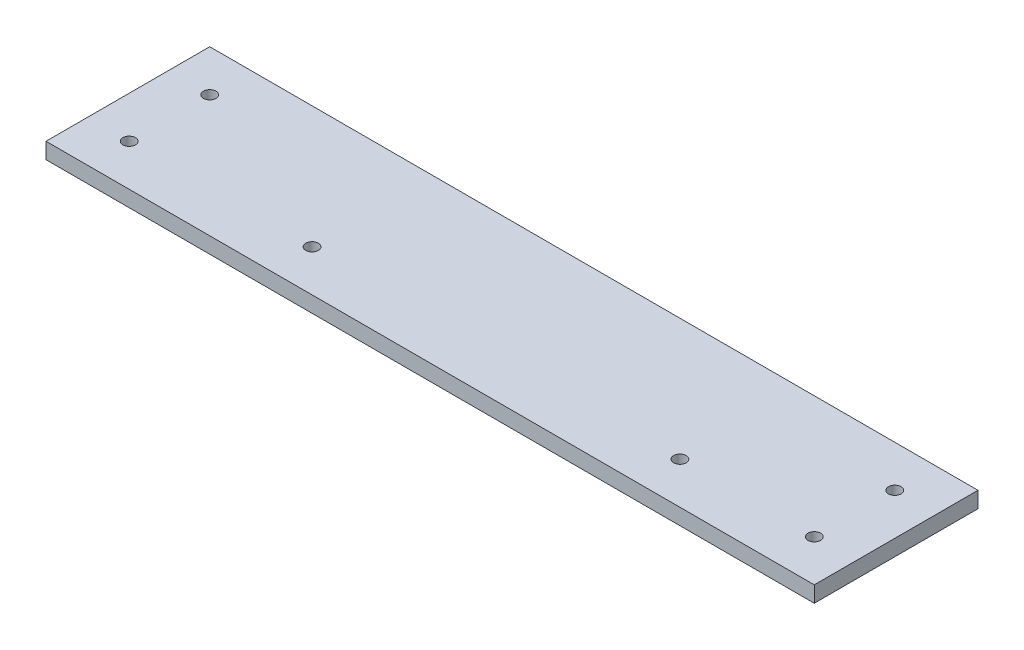
ISO-10303-21;
HEADER;
FILE_DESCRIPTION(('STEP AP214'),'2;1');
FILE_NAME('part.step','',(''),(''),'','','');
FILE_SCHEMA(('AUTOMOTIVE_DESIGN { 1 0 10303 214 1 1 1 1 }'));
ENDSEC;
DATA;
#1=APPLICATION_CONTEXT('core data for automotive mechanical design processes');
#2=APPLICATION_PROTOCOL_DEFINITION('international standard','automotive_design',2000,#1);
#3=PRODUCT_CONTEXT('',#1,'mechanical');
#4=PRODUCT('Part','Part','',(#3));
#5=PRODUCT_RELATED_PRODUCT_CATEGORY('part','',(#4));
#6=PRODUCT_DEFINITION_FORMATION('','',#4);
#7=PRODUCT_DEFINITION_CONTEXT('part definition',#1,'design');
#8=PRODUCT_DEFINITION('design','',#6,#7);
#9=PRODUCT_DEFINITION_SHAPE('','',#8);
#10=(LENGTH_UNIT() NAMED_UNIT(*) SI_UNIT(.MILLI.,.METRE.));
#11=(NAMED_UNIT(*) PLANE_ANGLE_UNIT() SI_UNIT($,.RADIAN.));
#12=(NAMED_UNIT(*) SI_UNIT($,.STERADIAN.) SOLID_ANGLE_UNIT());
#13=UNCERTAINTY_MEASURE_WITH_UNIT(LENGTH_MEASURE(1.E-05),#10,'distance_accuracy_value','');
#14=(GEOMETRIC_REPRESENTATION_CONTEXT(3) GLOBAL_UNCERTAINTY_ASSIGNED_CONTEXT((#13)) GLOBAL_UNIT_ASSIGNED_CONTEXT((#10,
#11,#12)) REPRESENTATION_CONTEXT('',''));
#15=CARTESIAN_POINT('',(0.,0.,0.));
#16=DIRECTION('',(0.,0.,1.));
#17=DIRECTION('',(1.,0.,0.));
#18=AXIS2_PLACEMENT_3D('',#15,#16,#17);
#19=CARTESIAN_POINT('',(152.5,3.175,32.5));
#20=DIRECTION('',(-1.,0.,0.));
#21=DIRECTION('',(0.,0.,1.));
#22=AXIS2_PLACEMENT_3D('',#19,#20,#21);
#23=PLANE('',#22);
#24=DIRECTION('',(0.,0.,-1.));
#25=VECTOR('',#24,1.);
#26=CARTESIAN_POINT('',(152.5,-3.175,32.5));
#27=LINE('',#26,#25);
#28=CARTESIAN_POINT('',(152.5,-3.175,32.5));
#29=VERTEX_POINT('',#28);
#30=CARTESIAN_POINT('',(152.5,-3.175,-32.5));
#31=VERTEX_POINT('',#30);
#32=EDGE_CURVE('E99',#29,#31,#27,.T.);
#33=ORIENTED_EDGE('',*,*,#32,.T.);
#34=DIRECTION('',(0.,-1.,0.));
#35=VECTOR('',#34,1.);
#36=CARTESIAN_POINT('',(152.5,3.175,-32.5));
#37=LINE('',#36,#35);
#38=CARTESIAN_POINT('',(152.5,3.175,-32.5));
#39=VERTEX_POINT('',#38);
#40=EDGE_CURVE('E11',#39,#31,#37,.T.);
#41=ORIENTED_EDGE('',*,*,#40,.F.);
#42=DIRECTION('',(0.,0.,-1.));
#43=VECTOR('',#42,1.);
#44=CARTESIAN_POINT('',(152.5,3.175,32.5));
#45=LINE('',#44,#43);
#46=CARTESIAN_POINT('',(152.5,3.175,32.5));
#47=VERTEX_POINT('',#46);
#48=EDGE_CURVE('E87',#47,#39,#45,.T.);
#49=ORIENTED_EDGE('',*,*,#48,.F.);
#50=DIRECTION('',(0.,-1.,0.));
#51=VECTOR('',#50,1.);
#52=CARTESIAN_POINT('',(152.5,3.175,32.5));
#53=LINE('',#52,#51);
#54=EDGE_CURVE('E95',#47,#29,#53,.T.);
#55=ORIENTED_EDGE('',*,*,#54,.T.);
#56=EDGE_LOOP('',(#33,#41,#49,#55));
#57=FACE_BOUND('',#56,.T.);
#58=ADVANCED_FACE('F36',(#57),#23,.F.);
#59=CARTESIAN_POINT('',(-152.5,3.175,-32.5));
#60=DIRECTION('',(0.,0.,1.));
#61=DIRECTION('',(1.,0.,0.));
#62=AXIS2_PLACEMENT_3D('',#59,#60,#61);
#63=PLANE('',#62);
#64=DIRECTION('',(-1.,0.,0.));
#65=VECTOR('',#64,1.);
#66=CARTESIAN_POINT('',(-152.5,-3.175,-32.5));
#67=LINE('',#66,#65);
#68=CARTESIAN_POINT('',(-152.5,-3.175,-32.5));
#69=VERTEX_POINT('',#68);
#70=EDGE_CURVE('E91',#31,#69,#67,.T.);
#71=ORIENTED_EDGE('',*,*,#70,.T.);
#72=DIRECTION('',(0.,-1.,0.));
#73=VECTOR('',#72,1.);
#74=CARTESIAN_POINT('',(-152.5,3.175,-32.5));
#75=LINE('',#74,#73);
#76=CARTESIAN_POINT('',(-152.5,3.175,-32.5));
#77=VERTEX_POINT('',#76);
#78=EDGE_CURVE('E44',#77,#69,#75,.T.);
#79=ORIENTED_EDGE('',*,*,#78,.F.);
#80=DIRECTION('',(-1.,0.,0.));
#81=VECTOR('',#80,1.);
#82=CARTESIAN_POINT('',(-152.5,3.175,-32.5));
#83=LINE('',#82,#81);
#84=EDGE_CURVE('E82',#39,#77,#83,.T.);
#85=ORIENTED_EDGE('',*,*,#84,.F.);
#86=ORIENTED_EDGE('',*,*,#40,.T.);
#87=EDGE_LOOP('',(#71,#79,#85,#86));
#88=FACE_BOUND('',#87,.T.);
#89=ADVANCED_FACE('F90',(#88),#63,.F.);
#90=CARTESIAN_POINT('',(-152.5,3.175,32.5));
#91=DIRECTION('',(1.,0.,0.));
#92=DIRECTION('',(0.,0.,-1.));
#93=AXIS2_PLACEMENT_3D('',#90,#91,#92);
#94=PLANE('',#93);
#95=DIRECTION('',(0.,0.,1.));
#96=VECTOR('',#95,1.);
#97=CARTESIAN_POINT('',(-152.5,-3.175,32.5));
#98=LINE('',#97,#96);
#99=CARTESIAN_POINT('',(-152.5,-3.175,32.5));
#100=VERTEX_POINT('',#99);
#101=EDGE_CURVE('E69',#69,#100,#98,.T.);
#102=ORIENTED_EDGE('',*,*,#101,.T.);
#103=DIRECTION('',(0.,-1.,0.));
#104=VECTOR('',#103,1.);
#105=CARTESIAN_POINT('',(-152.5,3.175,32.5));
#106=LINE('',#105,#104);
#107=CARTESIAN_POINT('',(-152.5,3.175,32.5));
#108=VERTEX_POINT('',#107);
#109=EDGE_CURVE('E92',#108,#100,#106,.T.);
#110=ORIENTED_EDGE('',*,*,#109,.F.);
#111=DIRECTION('',(0.,0.,1.));
#112=VECTOR('',#111,1.);
#113=CARTESIAN_POINT('',(-152.5,3.175,32.5));
#114=LINE('',#113,#112);
#115=EDGE_CURVE('E85',#77,#108,#114,.T.);
#116=ORIENTED_EDGE('',*,*,#115,.F.);
#117=ORIENTED_EDGE('',*,*,#78,.T.);
#118=EDGE_LOOP('',(#102,#110,#116,#117));
#119=FACE_BOUND('',#118,.T.);
#120=ADVANCED_FACE('F93',(#119),#94,.F.);
#121=CARTESIAN_POINT('',(-152.5,3.175,32.5));
#122=DIRECTION('',(0.,0.,-1.));
#123=DIRECTION('',(-1.,0.,0.));
#124=AXIS2_PLACEMENT_3D('',#121,#122,#123);
#125=PLANE('',#124);
#126=DIRECTION('',(1.,0.,0.));
#127=VECTOR('',#126,1.);
#128=CARTESIAN_POINT('',(-152.5,-3.175,32.5));
#129=LINE('',#128,#127);
#130=EDGE_CURVE('E75',#100,#29,#129,.T.);
#131=ORIENTED_EDGE('',*,*,#130,.T.);
#132=ORIENTED_EDGE('',*,*,#54,.F.);
#133=DIRECTION('',(1.,0.,0.));
#134=VECTOR('',#133,1.);
#135=CARTESIAN_POINT('',(-152.5,3.175,32.5));
#136=LINE('',#135,#134);
#137=EDGE_CURVE('E52',#108,#47,#136,.T.);
#138=ORIENTED_EDGE('',*,*,#137,.F.);
#139=ORIENTED_EDGE('',*,*,#109,.T.);
#140=EDGE_LOOP('',(#131,#132,#138,#139));
#141=FACE_BOUND('',#140,.T.);
#142=ADVANCED_FACE('F107',(#141),#125,.F.);
#143=CARTESIAN_POINT('',(0.,3.175,0.));
#144=DIRECTION('',(0.,-1.,0.));
#145=DIRECTION('',(0.,0.,-1.));
#146=AXIS2_PLACEMENT_3D('',#143,#144,#145);
#147=PLANE('',#146);
#148=CARTESIAN_POINT('',(82.64,3.175,15.98));
#149=DIRECTION('',(0.,-1.,0.));
#150=DIRECTION('',(0.,0.,-1.));
#151=AXIS2_PLACEMENT_3D('',#148,#149,#150);
#152=CIRCLE('',#151,2.49999999999995);
#153=CARTESIAN_POINT('',(82.64,3.175,13.4800000000001));
#154=VERTEX_POINT('',#153);
#155=EDGE_CURVE('E132',#154,#154,#152,.T.);
#156=ORIENTED_EDGE('',*,*,#155,.T.);
#157=EDGE_LOOP('',(#156));
#158=FACE_BOUND('',#157,.T.);
#159=CARTESIAN_POINT('',(-63.41,3.175,15.98));
#160=DIRECTION('',(0.,-1.,0.));
#161=DIRECTION('',(0.,0.,-1.));
#162=AXIS2_PLACEMENT_3D('',#159,#160,#161);
#163=CIRCLE('',#162,2.49999999999995);
#164=CARTESIAN_POINT('',(-63.41,3.175,13.4800000000001));
#165=VERTEX_POINT('',#164);
#166=EDGE_CURVE('E139',#165,#165,#163,.T.);
#167=ORIENTED_EDGE('',*,*,#166,.T.);
#168=EDGE_LOOP('',(#167));
#169=FACE_BOUND('',#168,.T.);
#170=CARTESIAN_POINT('',(135.98,3.175,15.98));
#171=DIRECTION('',(0.,1.,0.));
#172=DIRECTION('',(0.,0.,-1.));
#173=AXIS2_PLACEMENT_3D('',#170,#171,#172);
#174=CIRCLE('',#173,2.49999999999994);
#175=CARTESIAN_POINT('',(135.98,3.175,13.4800000000001));
#176=VERTEX_POINT('',#175);
#177=EDGE_CURVE('E120',#176,#176,#174,.T.);
#178=ORIENTED_EDGE('',*,*,#177,.F.);
#179=EDGE_LOOP('',(#178));
#180=FACE_BOUND('',#179,.T.);
#181=CARTESIAN_POINT('',(135.98,3.175,-15.98));
#182=DIRECTION('',(0.,1.,0.));
#183=DIRECTION('',(0.,0.,1.));
#184=AXIS2_PLACEMENT_3D('',#181,#182,#183);
#185=CIRCLE('',#184,2.49999999999994);
#186=CARTESIAN_POINT('',(135.98,3.175,-13.4800000000001));
#187=VERTEX_POINT('',#186);
#188=EDGE_CURVE('E125',#187,#187,#185,.T.);
#189=ORIENTED_EDGE('',*,*,#188,.F.);
#190=EDGE_LOOP('',(#189));
#191=FACE_BOUND('',#190,.T.);
#192=CARTESIAN_POINT('',(-135.98,3.175,15.98));
#193=DIRECTION('',(0.,-1.,0.));
#194=DIRECTION('',(0.,0.,-1.));
#195=AXIS2_PLACEMENT_3D('',#192,#193,#194);
#196=CIRCLE('',#195,2.49999999999994);
#197=CARTESIAN_POINT('',(-135.98,3.175,13.4800000000001));
#198=VERTEX_POINT('',#197);
#199=EDGE_CURVE('E102',#198,#198,#196,.T.);
#200=ORIENTED_EDGE('',*,*,#199,.T.);
#201=EDGE_LOOP('',(#200));
#202=FACE_BOUND('',#201,.T.);
#203=CARTESIAN_POINT('',(-135.98,3.175,-15.98));
#204=DIRECTION('',(0.,-1.,0.));
#205=DIRECTION('',(0.,0.,1.));
#206=AXIS2_PLACEMENT_3D('',#203,#204,#205);
#207=CIRCLE('',#206,2.49999999999994);
#208=CARTESIAN_POINT('',(-135.98,3.175,-13.4800000000001));
#209=VERTEX_POINT('',#208);
#210=EDGE_CURVE('E113',#209,#209,#207,.T.);
#211=ORIENTED_EDGE('',*,*,#210,.T.);
#212=EDGE_LOOP('',(#211));
#213=FACE_BOUND('',#212,.T.);
#214=ORIENTED_EDGE('',*,*,#48,.T.);
#215=ORIENTED_EDGE('',*,*,#84,.T.);
#216=ORIENTED_EDGE('',*,*,#115,.T.);
#217=ORIENTED_EDGE('',*,*,#137,.T.);
#218=EDGE_LOOP('',(#214,#215,#216,#217));
#219=FACE_BOUND('',#218,.T.);
#220=ADVANCED_FACE('F83',(#158,#169,#180,#191,#202,#213,#219),#147,.F.);
#221=CARTESIAN_POINT('',(0.,-3.175,0.));
#222=DIRECTION('',(0.,-1.,0.));
#223=DIRECTION('',(0.,0.,-1.));
#224=AXIS2_PLACEMENT_3D('',#221,#222,#223);
#225=PLANE('',#224);
#226=CARTESIAN_POINT('',(82.64,-3.175,15.98));
#227=DIRECTION('',(0.,1.,0.));
#228=DIRECTION('',(0.,0.,1.));
#229=AXIS2_PLACEMENT_3D('',#226,#227,#228);
#230=CIRCLE('',#229,2.49999999999995);
#231=CARTESIAN_POINT('',(82.64,-3.175,18.48));
#232=VERTEX_POINT('',#231);
#233=EDGE_CURVE('E142',#232,#232,#230,.T.);
#234=ORIENTED_EDGE('',*,*,#233,.T.);
#235=EDGE_LOOP('',(#234));
#236=FACE_BOUND('',#235,.T.);
#237=CARTESIAN_POINT('',(-63.41,-3.175,15.98));
#238=DIRECTION('',(0.,1.,0.));
#239=DIRECTION('',(0.,0.,1.));
#240=AXIS2_PLACEMENT_3D('',#237,#238,#239);
#241=CIRCLE('',#240,2.49999999999995);
#242=CARTESIAN_POINT('',(-63.41,-3.175,18.48));
#243=VERTEX_POINT('',#242);
#244=EDGE_CURVE('E143',#243,#243,#241,.T.);
#245=ORIENTED_EDGE('',*,*,#244,.T.);
#246=EDGE_LOOP('',(#245));
#247=FACE_BOUND('',#246,.T.);
#248=CARTESIAN_POINT('',(135.98,-3.175,15.98));
#249=DIRECTION('',(0.,1.,0.));
#250=DIRECTION('',(0.,0.,-1.));
#251=AXIS2_PLACEMENT_3D('',#248,#249,#250);
#252=CIRCLE('',#251,2.49999999999994);
#253=CARTESIAN_POINT('',(135.98,-3.175,13.4800000000001));
#254=VERTEX_POINT('',#253);
#255=EDGE_CURVE('E128',#254,#254,#252,.T.);
#256=ORIENTED_EDGE('',*,*,#255,.T.);
#257=EDGE_LOOP('',(#256));
#258=FACE_BOUND('',#257,.T.);
#259=CARTESIAN_POINT('',(135.98,-3.175,-15.98));
#260=DIRECTION('',(0.,1.,0.));
#261=DIRECTION('',(0.,0.,1.));
#262=AXIS2_PLACEMENT_3D('',#259,#260,#261);
#263=CIRCLE('',#262,2.49999999999994);
#264=CARTESIAN_POINT('',(135.98,-3.175,-13.4800000000001));
#265=VERTEX_POINT('',#264);
#266=EDGE_CURVE('E129',#265,#265,#263,.T.);
#267=ORIENTED_EDGE('',*,*,#266,.T.);
#268=EDGE_LOOP('',(#267));
#269=FACE_BOUND('',#268,.T.);
#270=CARTESIAN_POINT('',(-135.98,-3.175,15.98));
#271=DIRECTION('',(0.,-1.,0.));
#272=DIRECTION('',(0.,0.,-1.));
#273=AXIS2_PLACEMENT_3D('',#270,#271,#272);
#274=CIRCLE('',#273,2.49999999999994);
#275=CARTESIAN_POINT('',(-135.98,-3.175,13.4800000000001));
#276=VERTEX_POINT('',#275);
#277=EDGE_CURVE('E116',#276,#276,#274,.T.);
#278=ORIENTED_EDGE('',*,*,#277,.F.);
#279=EDGE_LOOP('',(#278));
#280=FACE_BOUND('',#279,.T.);
#281=CARTESIAN_POINT('',(-135.98,-3.175,-15.98));
#282=DIRECTION('',(0.,-1.,0.));
#283=DIRECTION('',(0.,0.,1.));
#284=AXIS2_PLACEMENT_3D('',#281,#282,#283);
#285=CIRCLE('',#284,2.49999999999994);
#286=CARTESIAN_POINT('',(-135.98,-3.175,-13.4800000000001));
#287=VERTEX_POINT('',#286);
#288=EDGE_CURVE('E117',#287,#287,#285,.T.);
#289=ORIENTED_EDGE('',*,*,#288,.F.);
#290=EDGE_LOOP('',(#289));
#291=FACE_BOUND('',#290,.T.);
#292=ORIENTED_EDGE('',*,*,#32,.F.);
#293=ORIENTED_EDGE('',*,*,#130,.F.);
#294=ORIENTED_EDGE('',*,*,#101,.F.);
#295=ORIENTED_EDGE('',*,*,#70,.F.);
#296=EDGE_LOOP('',(#292,#293,#294,#295));
#297=FACE_BOUND('',#296,.T.);
#298=ADVANCED_FACE('F110',(#236,#247,#258,#269,#280,#291,#297),#225,.T.);
#299=CARTESIAN_POINT('',(-135.98,3.175,-15.98));
#300=DIRECTION('',(0.,-1.,0.));
#301=DIRECTION('',(0.,0.,-1.));
#302=AXIS2_PLACEMENT_3D('',#299,#300,#301);
#303=CYLINDRICAL_SURFACE('',#302,2.49999999999994);
#304=ORIENTED_EDGE('',*,*,#210,.F.);
#305=EDGE_LOOP('',(#304));
#306=FACE_BOUND('',#305,.T.);
#307=ORIENTED_EDGE('',*,*,#288,.T.);
#308=EDGE_LOOP('',(#307));
#309=FACE_BOUND('',#308,.T.);
#310=ADVANCED_FACE('F171',(#306,#309),#303,.F.);
#311=CARTESIAN_POINT('',(-135.98,3.175,15.98));
#312=DIRECTION('',(0.,-1.,0.));
#313=DIRECTION('',(0.,0.,-1.));
#314=AXIS2_PLACEMENT_3D('',#311,#312,#313);
#315=CYLINDRICAL_SURFACE('',#314,2.49999999999994);
#316=ORIENTED_EDGE('',*,*,#199,.F.);
#317=EDGE_LOOP('',(#316));
#318=FACE_BOUND('',#317,.T.);
#319=ORIENTED_EDGE('',*,*,#277,.T.);
#320=EDGE_LOOP('',(#319));
#321=FACE_BOUND('',#320,.T.);
#322=ADVANCED_FACE('F174',(#318,#321),#315,.F.);
#323=CARTESIAN_POINT('',(135.98,3.175,-15.98));
#324=DIRECTION('',(0.,-1.,0.));
#325=DIRECTION('',(0.,0.,-1.));
#326=AXIS2_PLACEMENT_3D('',#323,#324,#325);
#327=CYLINDRICAL_SURFACE('',#326,2.49999999999994);
#328=ORIENTED_EDGE('',*,*,#188,.T.);
#329=EDGE_LOOP('',(#328));
#330=FACE_BOUND('',#329,.T.);
#331=ORIENTED_EDGE('',*,*,#266,.F.);
#332=EDGE_LOOP('',(#331));
#333=FACE_BOUND('',#332,.T.);
#334=ADVANCED_FACE('F234',(#330,#333),#327,.F.);
#335=CARTESIAN_POINT('',(135.98,3.175,15.98));
#336=DIRECTION('',(0.,-1.,0.));
#337=DIRECTION('',(0.,0.,-1.));
#338=AXIS2_PLACEMENT_3D('',#335,#336,#337);
#339=CYLINDRICAL_SURFACE('',#338,2.49999999999994);
#340=ORIENTED_EDGE('',*,*,#177,.T.);
#341=EDGE_LOOP('',(#340));
#342=FACE_BOUND('',#341,.T.);
#343=ORIENTED_EDGE('',*,*,#255,.F.);
#344=EDGE_LOOP('',(#343));
#345=FACE_BOUND('',#344,.T.);
#346=ADVANCED_FACE('F207',(#342,#345),#339,.F.);
#347=CARTESIAN_POINT('',(-63.41,-3.175,15.98));
#348=DIRECTION('',(0.,1.,0.));
#349=DIRECTION('',(0.,0.,1.));
#350=AXIS2_PLACEMENT_3D('',#347,#348,#349);
#351=CYLINDRICAL_SURFACE('',#350,2.49999999999995);
#352=ORIENTED_EDGE('',*,*,#244,.F.);
#353=EDGE_LOOP('',(#352));
#354=FACE_BOUND('',#353,.T.);
#355=ORIENTED_EDGE('',*,*,#166,.F.);
#356=EDGE_LOOP('',(#355));
#357=FACE_BOUND('',#356,.T.);
#358=ADVANCED_FACE('F154',(#354,#357),#351,.F.);
#359=CARTESIAN_POINT('',(82.64,-3.175,15.98));
#360=DIRECTION('',(0.,1.,0.));
#361=DIRECTION('',(0.,0.,1.));
#362=AXIS2_PLACEMENT_3D('',#359,#360,#361);
#363=CYLINDRICAL_SURFACE('',#362,2.49999999999995);
#364=ORIENTED_EDGE('',*,*,#233,.F.);
#365=EDGE_LOOP('',(#364));
#366=FACE_BOUND('',#365,.T.);
#367=ORIENTED_EDGE('',*,*,#155,.F.);
#368=EDGE_LOOP('',(#367));
#369=FACE_BOUND('',#368,.T.);
#370=ADVANCED_FACE('F151',(#366,#369),#363,.F.);
#371=CLOSED_SHELL('',(#58,#89,#120,#142,#220,#298,#310,#322,#334,#346,#358,#370));
#372=MANIFOLD_SOLID_BREP('B2',#371);
#373=ADVANCED_BREP_SHAPE_REPRESENTATION('',(#18,#372),#14);
#374=SHAPE_DEFINITION_REPRESENTATION(#9,#373);
ENDSEC;
END-ISO-10303-21;
